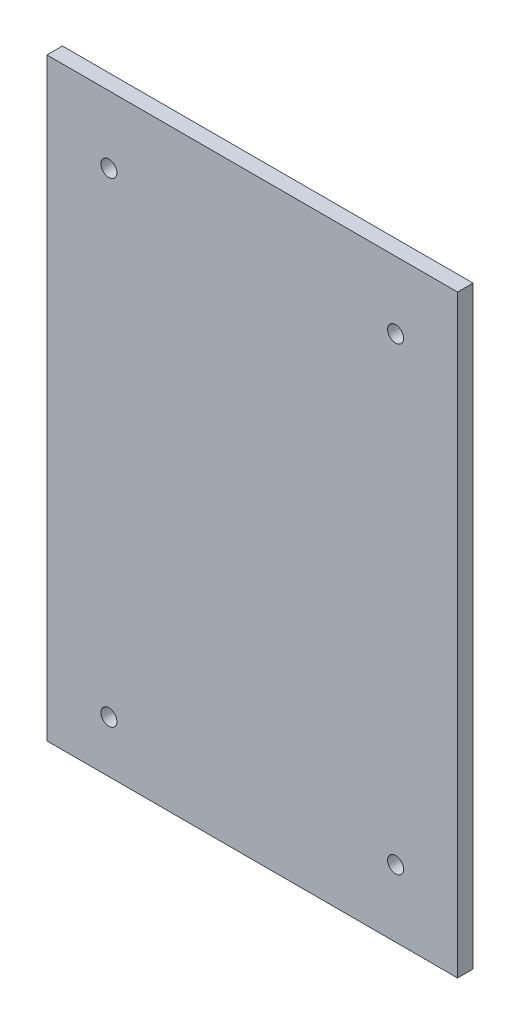
ISO-10303-21;
HEADER;
FILE_DESCRIPTION(('STEP AP214'),'2;1');
FILE_NAME('part.step','',(''),(''),'','','');
FILE_SCHEMA(('AUTOMOTIVE_DESIGN { 1 0 10303 214 1 1 1 1 }'));
ENDSEC;
DATA;
#1=APPLICATION_CONTEXT('core data for automotive mechanical design processes');
#2=APPLICATION_PROTOCOL_DEFINITION('international standard','automotive_design',2000,#1);
#3=PRODUCT_CONTEXT('',#1,'mechanical');
#4=PRODUCT('Part','Part','',(#3));
#5=PRODUCT_RELATED_PRODUCT_CATEGORY('part','',(#4));
#6=PRODUCT_DEFINITION_FORMATION('','',#4);
#7=PRODUCT_DEFINITION_CONTEXT('part definition',#1,'design');
#8=PRODUCT_DEFINITION('design','',#6,#7);
#9=PRODUCT_DEFINITION_SHAPE('','',#8);
#10=(LENGTH_UNIT() NAMED_UNIT(*) SI_UNIT(.MILLI.,.METRE.));
#11=(NAMED_UNIT(*) PLANE_ANGLE_UNIT() SI_UNIT($,.RADIAN.));
#12=(NAMED_UNIT(*) SI_UNIT($,.STERADIAN.) SOLID_ANGLE_UNIT());
#13=UNCERTAINTY_MEASURE_WITH_UNIT(LENGTH_MEASURE(1.E-05),#10,'distance_accuracy_value','');
#14=(GEOMETRIC_REPRESENTATION_CONTEXT(3) GLOBAL_UNCERTAINTY_ASSIGNED_CONTEXT((#13)) GLOBAL_UNIT_ASSIGNED_CONTEXT((#10,
#11,#12)) REPRESENTATION_CONTEXT('',''));
#15=CARTESIAN_POINT('',(0.,0.,0.));
#16=DIRECTION('',(0.,0.,1.));
#17=DIRECTION('',(1.,0.,0.));
#18=AXIS2_PLACEMENT_3D('',#15,#16,#17);
#19=CARTESIAN_POINT('',(0.,0.,3.));
#20=DIRECTION('',(0.,0.,-1.));
#21=DIRECTION('',(-1.,0.,0.));
#22=AXIS2_PLACEMENT_3D('',#19,#20,#21);
#23=PLANE('',#22);
#24=DIRECTION('',(0.,1.,0.));
#25=VECTOR('',#24,1.);
#26=CARTESIAN_POINT('',(39.75,-57.5,3.));
#27=LINE('',#26,#25);
#28=CARTESIAN_POINT('',(39.75,-57.5,3.));
#29=VERTEX_POINT('',#28);
#30=CARTESIAN_POINT('',(39.75,57.5,3.));
#31=VERTEX_POINT('',#30);
#32=EDGE_CURVE('E85',#29,#31,#27,.T.);
#33=ORIENTED_EDGE('',*,*,#32,.T.);
#34=DIRECTION('',(-1.,0.,0.));
#35=VECTOR('',#34,1.);
#36=CARTESIAN_POINT('',(-39.75,57.5,3.));
#37=LINE('',#36,#35);
#38=CARTESIAN_POINT('',(-39.75,57.5,3.));
#39=VERTEX_POINT('',#38);
#40=EDGE_CURVE('E80',#31,#39,#37,.T.);
#41=ORIENTED_EDGE('',*,*,#40,.T.);
#42=DIRECTION('',(0.,-1.,0.));
#43=VECTOR('',#42,1.);
#44=CARTESIAN_POINT('',(-39.75,-57.5,3.));
#45=LINE('',#44,#43);
#46=CARTESIAN_POINT('',(-39.75,-57.5,3.));
#47=VERTEX_POINT('',#46);
#48=EDGE_CURVE('E83',#39,#47,#45,.T.);
#49=ORIENTED_EDGE('',*,*,#48,.T.);
#50=DIRECTION('',(1.,0.,0.));
#51=VECTOR('',#50,1.);
#52=CARTESIAN_POINT('',(-39.75,-57.5,3.));
#53=LINE('',#52,#51);
#54=EDGE_CURVE('E50',#47,#29,#53,.T.);
#55=ORIENTED_EDGE('',*,*,#54,.T.);
#56=EDGE_LOOP('',(#33,#41,#49,#55));
#57=FACE_BOUND('',#56,.T.);
#58=CARTESIAN_POINT('',(-27.75,44.5,3.));
#59=DIRECTION('',(0.,0.,1.));
#60=DIRECTION('',(1.,0.,0.));
#61=AXIS2_PLACEMENT_3D('',#58,#59,#60);
#62=CIRCLE('',#61,1.55);
#63=CARTESIAN_POINT('',(-26.2,44.5,3.));
#64=VERTEX_POINT('',#63);
#65=EDGE_CURVE('E100',#64,#64,#62,.T.);
#66=ORIENTED_EDGE('',*,*,#65,.F.);
#67=EDGE_LOOP('',(#66));
#68=FACE_BOUND('',#67,.T.);
#69=CARTESIAN_POINT('',(27.75,44.5,3.));
#70=DIRECTION('',(0.,0.,1.));
#71=DIRECTION('',(1.,0.,0.));
#72=AXIS2_PLACEMENT_3D('',#69,#70,#71);
#73=CIRCLE('',#72,1.55);
#74=CARTESIAN_POINT('',(29.3,44.5,3.));
#75=VERTEX_POINT('',#74);
#76=EDGE_CURVE('E115',#75,#75,#73,.T.);
#77=ORIENTED_EDGE('',*,*,#76,.F.);
#78=EDGE_LOOP('',(#77));
#79=FACE_BOUND('',#78,.T.);
#80=CARTESIAN_POINT('',(27.75,-44.5,3.));
#81=DIRECTION('',(0.,0.,1.));
#82=DIRECTION('',(-1.,0.,0.));
#83=AXIS2_PLACEMENT_3D('',#80,#81,#82);
#84=CIRCLE('',#83,1.55);
#85=CARTESIAN_POINT('',(26.2,-44.5,3.));
#86=VERTEX_POINT('',#85);
#87=EDGE_CURVE('E121',#86,#86,#84,.T.);
#88=ORIENTED_EDGE('',*,*,#87,.F.);
#89=EDGE_LOOP('',(#88));
#90=FACE_BOUND('',#89,.T.);
#91=CARTESIAN_POINT('',(-27.75,-47.5,3.));
#92=DIRECTION('',(0.,0.,1.));
#93=DIRECTION('',(-1.,0.,0.));
#94=AXIS2_PLACEMENT_3D('',#91,#92,#93);
#95=CIRCLE('',#94,1.55);
#96=CARTESIAN_POINT('',(-29.3,-47.5,3.));
#97=VERTEX_POINT('',#96);
#98=EDGE_CURVE('E127',#97,#97,#95,.T.);
#99=ORIENTED_EDGE('',*,*,#98,.F.);
#100=EDGE_LOOP('',(#99));
#101=FACE_BOUND('',#100,.T.);
#102=ADVANCED_FACE('F33',(#57,#68,#79,#90,#101),#23,.F.);
#103=CARTESIAN_POINT('',(0.,0.,0.));
#104=DIRECTION('',(0.,0.,-1.));
#105=DIRECTION('',(-1.,0.,0.));
#106=AXIS2_PLACEMENT_3D('',#103,#104,#105);
#107=PLANE('',#106);
#108=CARTESIAN_POINT('',(27.75,-44.5,0.));
#109=DIRECTION('',(0.,0.,1.));
#110=DIRECTION('',(-1.,0.,0.));
#111=AXIS2_PLACEMENT_3D('',#108,#109,#110);
#112=CIRCLE('',#111,1.55);
#113=CARTESIAN_POINT('',(26.2,-44.5,0.));
#114=VERTEX_POINT('',#113);
#115=EDGE_CURVE('E124',#114,#114,#112,.T.);
#116=ORIENTED_EDGE('',*,*,#115,.T.);
#117=EDGE_LOOP('',(#116));
#118=FACE_BOUND('',#117,.T.);
#119=CARTESIAN_POINT('',(-27.75,44.5,0.));
#120=DIRECTION('',(0.,0.,1.));
#121=DIRECTION('',(1.,0.,0.));
#122=AXIS2_PLACEMENT_3D('',#119,#120,#121);
#123=CIRCLE('',#122,1.55);
#124=CARTESIAN_POINT('',(-26.2,44.5,0.));
#125=VERTEX_POINT('',#124);
#126=EDGE_CURVE('E112',#125,#125,#123,.T.);
#127=ORIENTED_EDGE('',*,*,#126,.T.);
#128=EDGE_LOOP('',(#127));
#129=FACE_BOUND('',#128,.T.);
#130=DIRECTION('',(0.,1.,0.));
#131=VECTOR('',#130,1.);
#132=CARTESIAN_POINT('',(39.75,-57.5,0.));
#133=LINE('',#132,#131);
#134=CARTESIAN_POINT('',(39.75,-57.5,0.));
#135=VERTEX_POINT('',#134);
#136=CARTESIAN_POINT('',(39.75,57.5,0.));
#137=VERTEX_POINT('',#136);
#138=EDGE_CURVE('E97',#135,#137,#133,.T.);
#139=ORIENTED_EDGE('',*,*,#138,.F.);
#140=DIRECTION('',(1.,0.,0.));
#141=VECTOR('',#140,1.);
#142=CARTESIAN_POINT('',(-39.75,-57.5,0.));
#143=LINE('',#142,#141);
#144=CARTESIAN_POINT('',(-39.75,-57.5,0.));
#145=VERTEX_POINT('',#144);
#146=EDGE_CURVE('E73',#145,#135,#143,.T.);
#147=ORIENTED_EDGE('',*,*,#146,.F.);
#148=DIRECTION('',(0.,-1.,0.));
#149=VECTOR('',#148,1.);
#150=CARTESIAN_POINT('',(-39.75,-57.5,0.));
#151=LINE('',#150,#149);
#152=CARTESIAN_POINT('',(-39.75,57.5,0.));
#153=VERTEX_POINT('',#152);
#154=EDGE_CURVE('E67',#153,#145,#151,.T.);
#155=ORIENTED_EDGE('',*,*,#154,.F.);
#156=DIRECTION('',(-1.,0.,0.));
#157=VECTOR('',#156,1.);
#158=CARTESIAN_POINT('',(-39.75,57.5,0.));
#159=LINE('',#158,#157);
#160=EDGE_CURVE('E89',#137,#153,#159,.T.);
#161=ORIENTED_EDGE('',*,*,#160,.F.);
#162=EDGE_LOOP('',(#139,#147,#155,#161));
#163=FACE_BOUND('',#162,.T.);
#164=CARTESIAN_POINT('',(27.75,44.5,0.));
#165=DIRECTION('',(0.,0.,1.));
#166=DIRECTION('',(1.,0.,0.));
#167=AXIS2_PLACEMENT_3D('',#164,#165,#166);
#168=CIRCLE('',#167,1.55);
#169=CARTESIAN_POINT('',(29.3,44.5,0.));
#170=VERTEX_POINT('',#169);
#171=EDGE_CURVE('E118',#170,#170,#168,.T.);
#172=ORIENTED_EDGE('',*,*,#171,.T.);
#173=EDGE_LOOP('',(#172));
#174=FACE_BOUND('',#173,.T.);
#175=CARTESIAN_POINT('',(-27.75,-47.5,0.));
#176=DIRECTION('',(0.,0.,1.));
#177=DIRECTION('',(-1.,0.,0.));
#178=AXIS2_PLACEMENT_3D('',#175,#176,#177);
#179=CIRCLE('',#178,1.55);
#180=CARTESIAN_POINT('',(-29.3,-47.5,0.));
#181=VERTEX_POINT('',#180);
#182=EDGE_CURVE('E130',#181,#181,#179,.T.);
#183=ORIENTED_EDGE('',*,*,#182,.T.);
#184=EDGE_LOOP('',(#183));
#185=FACE_BOUND('',#184,.T.);
#186=ADVANCED_FACE('F108',(#118,#129,#163,#174,#185),#107,.T.);
#187=CARTESIAN_POINT('',(39.75,-57.5,3.));
#188=DIRECTION('',(-1.,0.,0.));
#189=DIRECTION('',(0.,0.,1.));
#190=AXIS2_PLACEMENT_3D('',#187,#188,#189);
#191=PLANE('',#190);
#192=ORIENTED_EDGE('',*,*,#138,.T.);
#193=DIRECTION('',(0.,0.,-1.));
#194=VECTOR('',#193,1.);
#195=CARTESIAN_POINT('',(39.75,57.5,3.));
#196=LINE('',#195,#194);
#197=EDGE_CURVE('E11',#31,#137,#196,.T.);
#198=ORIENTED_EDGE('',*,*,#197,.F.);
#199=ORIENTED_EDGE('',*,*,#32,.F.);
#200=DIRECTION('',(0.,0.,-1.));
#201=VECTOR('',#200,1.);
#202=CARTESIAN_POINT('',(39.75,-57.5,3.));
#203=LINE('',#202,#201);
#204=EDGE_CURVE('E93',#29,#135,#203,.T.);
#205=ORIENTED_EDGE('',*,*,#204,.T.);
#206=EDGE_LOOP('',(#192,#198,#199,#205));
#207=FACE_BOUND('',#206,.T.);
#208=ADVANCED_FACE('F35',(#207),#191,.F.);
#209=CARTESIAN_POINT('',(-39.75,57.5,3.));
#210=DIRECTION('',(0.,-1.,0.));
#211=DIRECTION('',(0.,0.,-1.));
#212=AXIS2_PLACEMENT_3D('',#209,#210,#211);
#213=PLANE('',#212);
#214=ORIENTED_EDGE('',*,*,#160,.T.);
#215=DIRECTION('',(0.,0.,-1.));
#216=VECTOR('',#215,1.);
#217=CARTESIAN_POINT('',(-39.75,57.5,3.));
#218=LINE('',#217,#216);
#219=EDGE_CURVE('E42',#39,#153,#218,.T.);
#220=ORIENTED_EDGE('',*,*,#219,.F.);
#221=ORIENTED_EDGE('',*,*,#40,.F.);
#222=ORIENTED_EDGE('',*,*,#197,.T.);
#223=EDGE_LOOP('',(#214,#220,#221,#222));
#224=FACE_BOUND('',#223,.T.);
#225=ADVANCED_FACE('F88',(#224),#213,.F.);
#226=CARTESIAN_POINT('',(-39.75,-57.5,3.));
#227=DIRECTION('',(1.,0.,0.));
#228=DIRECTION('',(0.,0.,-1.));
#229=AXIS2_PLACEMENT_3D('',#226,#227,#228);
#230=PLANE('',#229);
#231=ORIENTED_EDGE('',*,*,#154,.T.);
#232=DIRECTION('',(0.,0.,-1.));
#233=VECTOR('',#232,1.);
#234=CARTESIAN_POINT('',(-39.75,-57.5,3.));
#235=LINE('',#234,#233);
#236=EDGE_CURVE('E90',#47,#145,#235,.T.);
#237=ORIENTED_EDGE('',*,*,#236,.F.);
#238=ORIENTED_EDGE('',*,*,#48,.F.);
#239=ORIENTED_EDGE('',*,*,#219,.T.);
#240=EDGE_LOOP('',(#231,#237,#238,#239));
#241=FACE_BOUND('',#240,.T.);
#242=ADVANCED_FACE('F91',(#241),#230,.F.);
#243=CARTESIAN_POINT('',(-39.75,-57.5,3.));
#244=DIRECTION('',(0.,1.,0.));
#245=DIRECTION('',(0.,0.,1.));
#246=AXIS2_PLACEMENT_3D('',#243,#244,#245);
#247=PLANE('',#246);
#248=ORIENTED_EDGE('',*,*,#146,.T.);
#249=ORIENTED_EDGE('',*,*,#204,.F.);
#250=ORIENTED_EDGE('',*,*,#54,.F.);
#251=ORIENTED_EDGE('',*,*,#236,.T.);
#252=EDGE_LOOP('',(#248,#249,#250,#251));
#253=FACE_BOUND('',#252,.T.);
#254=ADVANCED_FACE('F105',(#253),#247,.F.);
#255=CARTESIAN_POINT('',(-27.75,44.5,3.));
#256=DIRECTION('',(0.,0.,-1.));
#257=DIRECTION('',(-1.,0.,0.));
#258=AXIS2_PLACEMENT_3D('',#255,#256,#257);
#259=CYLINDRICAL_SURFACE('',#258,1.55);
#260=ORIENTED_EDGE('',*,*,#65,.T.);
#261=EDGE_LOOP('',(#260));
#262=FACE_BOUND('',#261,.T.);
#263=ORIENTED_EDGE('',*,*,#126,.F.);
#264=EDGE_LOOP('',(#263));
#265=FACE_BOUND('',#264,.T.);
#266=ADVANCED_FACE('F147',(#262,#265),#259,.F.);
#267=CARTESIAN_POINT('',(27.75,44.5,3.));
#268=DIRECTION('',(0.,0.,-1.));
#269=DIRECTION('',(-1.,0.,0.));
#270=AXIS2_PLACEMENT_3D('',#267,#268,#269);
#271=CYLINDRICAL_SURFACE('',#270,1.55);
#272=ORIENTED_EDGE('',*,*,#76,.T.);
#273=EDGE_LOOP('',(#272));
#274=FACE_BOUND('',#273,.T.);
#275=ORIENTED_EDGE('',*,*,#171,.F.);
#276=EDGE_LOOP('',(#275));
#277=FACE_BOUND('',#276,.T.);
#278=ADVANCED_FACE('F193',(#274,#277),#271,.F.);
#279=CARTESIAN_POINT('',(27.75,-44.5,3.));
#280=DIRECTION('',(0.,0.,-1.));
#281=DIRECTION('',(-1.,0.,0.));
#282=AXIS2_PLACEMENT_3D('',#279,#280,#281);
#283=CYLINDRICAL_SURFACE('',#282,1.55);
#284=ORIENTED_EDGE('',*,*,#87,.T.);
#285=EDGE_LOOP('',(#284));
#286=FACE_BOUND('',#285,.T.);
#287=ORIENTED_EDGE('',*,*,#115,.F.);
#288=EDGE_LOOP('',(#287));
#289=FACE_BOUND('',#288,.T.);
#290=ADVANCED_FACE('F201',(#286,#289),#283,.F.);
#291=CARTESIAN_POINT('',(-27.75,-47.5,3.));
#292=DIRECTION('',(0.,0.,-1.));
#293=DIRECTION('',(-1.,0.,0.));
#294=AXIS2_PLACEMENT_3D('',#291,#292,#293);
#295=CYLINDRICAL_SURFACE('',#294,1.55);
#296=ORIENTED_EDGE('',*,*,#98,.T.);
#297=EDGE_LOOP('',(#296));
#298=FACE_BOUND('',#297,.T.);
#299=ORIENTED_EDGE('',*,*,#182,.F.);
#300=EDGE_LOOP('',(#299));
#301=FACE_BOUND('',#300,.T.);
#302=ADVANCED_FACE('F136',(#298,#301),#295,.F.);
#303=CLOSED_SHELL('',(#102,#186,#208,#225,#242,#254,#266,#278,#290,#302));
#304=MANIFOLD_SOLID_BREP('B2',#303);
#305=ADVANCED_BREP_SHAPE_REPRESENTATION('',(#18,#304),#14);
#306=SHAPE_DEFINITION_REPRESENTATION(#9,#305);
ENDSEC;
END-ISO-10303-21;
